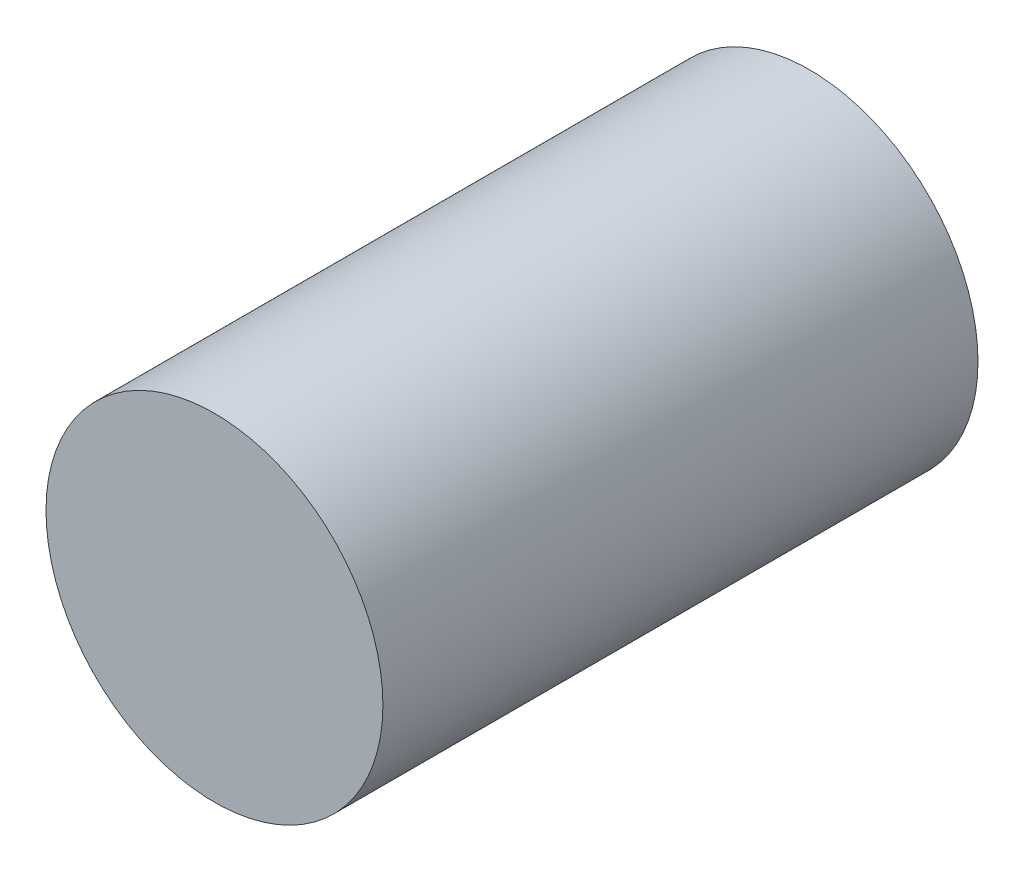
ISO-10303-21;
HEADER;
FILE_DESCRIPTION(('STEP AP214'),'2;1');
FILE_NAME('part.step','',(''),(''),'','','');
FILE_SCHEMA(('AUTOMOTIVE_DESIGN { 1 0 10303 214 1 1 1 1 }'));
ENDSEC;
DATA;
#1=APPLICATION_CONTEXT('core data for automotive mechanical design processes');
#2=APPLICATION_PROTOCOL_DEFINITION('international standard','automotive_design',2000,#1);
#3=PRODUCT_CONTEXT('',#1,'mechanical');
#4=PRODUCT('Part','Part','',(#3));
#5=PRODUCT_RELATED_PRODUCT_CATEGORY('part','',(#4));
#6=PRODUCT_DEFINITION_FORMATION('','',#4);
#7=PRODUCT_DEFINITION_CONTEXT('part definition',#1,'design');
#8=PRODUCT_DEFINITION('design','',#6,#7);
#9=PRODUCT_DEFINITION_SHAPE('','',#8);
#10=(LENGTH_UNIT() NAMED_UNIT(*) SI_UNIT(.MILLI.,.METRE.));
#11=(NAMED_UNIT(*) PLANE_ANGLE_UNIT() SI_UNIT($,.RADIAN.));
#12=(NAMED_UNIT(*) SI_UNIT($,.STERADIAN.) SOLID_ANGLE_UNIT());
#13=UNCERTAINTY_MEASURE_WITH_UNIT(LENGTH_MEASURE(1.E-05),#10,'distance_accuracy_value','');
#14=(GEOMETRIC_REPRESENTATION_CONTEXT(3) GLOBAL_UNCERTAINTY_ASSIGNED_CONTEXT((#13)) GLOBAL_UNIT_ASSIGNED_CONTEXT((#10,
#11,#12)) REPRESENTATION_CONTEXT('',''));
#15=CARTESIAN_POINT('',(0.,0.,0.));
#16=DIRECTION('',(0.,0.,1.));
#17=DIRECTION('',(1.,0.,0.));
#18=AXIS2_PLACEMENT_3D('',#15,#16,#17);
#19=CARTESIAN_POINT('',(0.,0.,47.69));
#20=DIRECTION('',(0.,0.,-1.));
#21=DIRECTION('',(-1.,0.,0.));
#22=AXIS2_PLACEMENT_3D('',#19,#20,#21);
#23=CYLINDRICAL_SURFACE('',#22,13.5);
#24=CARTESIAN_POINT('',(0.,0.,47.69));
#25=DIRECTION('',(0.,0.,1.));
#26=DIRECTION('',(1.,0.,0.));
#27=AXIS2_PLACEMENT_3D('',#24,#25,#26);
#28=CIRCLE('',#27,13.5);
#29=CARTESIAN_POINT('',(-13.5,0.,47.69));
#30=VERTEX_POINT('',#29);
#31=EDGE_CURVE('E10',#30,#30,#28,.T.);
#32=CARTESIAN_POINT('',(0.,0.,0.));
#33=DIRECTION('',(0.,0.,1.));
#34=DIRECTION('',(1.,0.,0.));
#35=AXIS2_PLACEMENT_3D('',#32,#33,#34);
#36=CIRCLE('',#35,13.5);
#37=CARTESIAN_POINT('',(-13.5,0.,0.));
#38=VERTEX_POINT('',#37);
#39=EDGE_CURVE('E35',#38,#38,#36,.T.);
#40=CARTESIAN_POINT('',(-13.5,0.,47.69));
#41=CARTESIAN_POINT('',(-13.5,0.,47.1932291666667));
#42=CARTESIAN_POINT('',(-13.5,0.,46.6964583333333));
#43=CARTESIAN_POINT('',(-13.5,0.,45.7029166666667));
#44=CARTESIAN_POINT('',(-13.5,0.,45.2061458333333));
#45=CARTESIAN_POINT('',(-13.5,0.,44.2126041666667));
#46=CARTESIAN_POINT('',(-13.5,0.,43.7158333333333));
#47=CARTESIAN_POINT('',(-13.5,0.,42.7222916666667));
#48=CARTESIAN_POINT('',(-13.5,0.,42.2255208333333));
#49=CARTESIAN_POINT('',(-13.5,0.,41.2319791666667));
#50=CARTESIAN_POINT('',(-13.5,0.,40.7352083333333));
#51=CARTESIAN_POINT('',(-13.5,0.,39.7416666666667));
#52=CARTESIAN_POINT('',(-13.5,0.,39.2448958333333));
#53=CARTESIAN_POINT('',(-13.5,0.,38.2513541666667));
#54=CARTESIAN_POINT('',(-13.5,0.,37.7545833333333));
#55=CARTESIAN_POINT('',(-13.5,0.,36.7610416666667));
#56=CARTESIAN_POINT('',(-13.5,0.,36.2642708333333));
#57=CARTESIAN_POINT('',(-13.5,0.,35.2707291666667));
#58=CARTESIAN_POINT('',(-13.5,0.,34.7739583333333));
#59=CARTESIAN_POINT('',(-13.5,0.,33.7804166666667));
#60=CARTESIAN_POINT('',(-13.5,0.,33.2836458333333));
#61=CARTESIAN_POINT('',(-13.5,0.,32.2901041666667));
#62=CARTESIAN_POINT('',(-13.5,0.,31.7933333333333));
#63=CARTESIAN_POINT('',(-13.5,0.,30.7997916666667));
#64=CARTESIAN_POINT('',(-13.5,0.,30.3030208333333));
#65=CARTESIAN_POINT('',(-13.5,0.,29.3094791666667));
#66=CARTESIAN_POINT('',(-13.5,0.,28.8127083333333));
#67=CARTESIAN_POINT('',(-13.5,0.,27.8191666666667));
#68=CARTESIAN_POINT('',(-13.5,0.,27.3223958333333));
#69=CARTESIAN_POINT('',(-13.5,0.,26.3288541666667));
#70=CARTESIAN_POINT('',(-13.5,0.,25.8320833333333));
#71=CARTESIAN_POINT('',(-13.5,0.,24.8385416666667));
#72=CARTESIAN_POINT('',(-13.5,0.,24.3417708333333));
#73=CARTESIAN_POINT('',(-13.5,0.,23.3482291666667));
#74=CARTESIAN_POINT('',(-13.5,0.,22.8514583333333));
#75=CARTESIAN_POINT('',(-13.5,0.,21.8579166666667));
#76=CARTESIAN_POINT('',(-13.5,0.,21.3611458333333));
#77=CARTESIAN_POINT('',(-13.5,0.,20.3676041666667));
#78=CARTESIAN_POINT('',(-13.5,0.,19.8708333333333));
#79=CARTESIAN_POINT('',(-13.5,0.,18.8772916666667));
#80=CARTESIAN_POINT('',(-13.5,0.,18.3805208333333));
#81=CARTESIAN_POINT('',(-13.5,0.,17.3869791666667));
#82=CARTESIAN_POINT('',(-13.5,0.,16.8902083333333));
#83=CARTESIAN_POINT('',(-13.5,0.,15.8966666666667));
#84=CARTESIAN_POINT('',(-13.5,0.,15.3998958333333));
#85=CARTESIAN_POINT('',(-13.5,0.,14.4063541666667));
#86=CARTESIAN_POINT('',(-13.5,0.,13.9095833333333));
#87=CARTESIAN_POINT('',(-13.5,0.,12.9160416666667));
#88=CARTESIAN_POINT('',(-13.5,0.,12.4192708333333));
#89=CARTESIAN_POINT('',(-13.5,0.,11.4257291666667));
#90=CARTESIAN_POINT('',(-13.5,0.,10.9289583333333));
#91=CARTESIAN_POINT('',(-13.5,0.,9.93541666666666));
#92=CARTESIAN_POINT('',(-13.5,0.,9.43864583333333));
#93=CARTESIAN_POINT('',(-13.5,0.,8.44510416666666));
#94=CARTESIAN_POINT('',(-13.5,0.,7.94833333333333));
#95=CARTESIAN_POINT('',(-13.5,0.,6.95479166666666));
#96=CARTESIAN_POINT('',(-13.5,0.,6.45802083333333));
#97=CARTESIAN_POINT('',(-13.5,0.,5.46447916666666));
#98=CARTESIAN_POINT('',(-13.5,0.,4.96770833333333));
#99=CARTESIAN_POINT('',(-13.5,0.,3.97416666666666));
#100=CARTESIAN_POINT('',(-13.5,0.,3.47739583333333));
#101=CARTESIAN_POINT('',(-13.5,0.,2.48385416666666));
#102=CARTESIAN_POINT('',(-13.5,0.,1.98708333333333));
#103=CARTESIAN_POINT('',(-13.5,0.,0.99354166666666));
#104=CARTESIAN_POINT('',(-13.5,0.,0.496770833333327));
#105=CARTESIAN_POINT('',(-13.5,0.,0.));
#106=B_SPLINE_CURVE_WITH_KNOTS('',3,(#40,#41,#42,#43,#44,#45,#46,#47,#48,#49,#50,#51,#52,#53,
#54,#55,#56,#57,#58,#59,#60,#61,#62,#63,#64,#65,#66,#67,#68,#69,#70,#71,#72,#73,#74,#75,#76,#77,
#78,#79,#80,#81,#82,#83,#84,#85,#86,#87,#88,#89,#90,#91,#92,#93,#94,#95,#96,#97,#98,#99,#100,
#101,#102,#103,#104,#105),.UNSPECIFIED.,.F.,.F.,(4,2,2,2,2,2,2,2,2,2,2,2,2,2,2,2,2,2,2,2,2,2,2,
2,2,2,2,2,2,2,2,2,4),(0.,1.49031249999999,2.98062499999999,4.47093749999999,5.96124999999999,
7.45156249999999,8.94187499999999,10.4321875,11.9225,13.4128125,14.903125,16.3934375,17.88375,
19.3740625,20.864375,22.3546875,23.845,25.3353125,26.825625,28.3159375,29.80625,31.2965625,
32.786875,34.2771875,35.7675,37.2578125,38.748125,40.2384375,41.72875,43.2190625,44.709375,
46.1996875,47.69),.UNSPECIFIED.);
#107=EDGE_CURVE('BSEAM32',#30,#38,#106,.T.);
#108=ORIENTED_EDGE('',*,*,#31,.F.);
#109=ORIENTED_EDGE('',*,*,#39,.T.);
#110=ORIENTED_EDGE('',*,*,#107,.T.);
#111=ORIENTED_EDGE('',*,*,#107,.F.);
#112=EDGE_LOOP('',(#108,#110,#109,#111));
#113=FACE_BOUND('',#112,.T.);
#114=ADVANCED_FACE('F32',(#113),#23,.T.);
#115=CARTESIAN_POINT('',(0.,0.,47.69));
#116=DIRECTION('',(0.,0.,1.));
#117=DIRECTION('',(1.,0.,0.));
#118=AXIS2_PLACEMENT_3D('',#115,#116,#117);
#119=PLANE('',#118);
#120=ORIENTED_EDGE('',*,*,#31,.T.);
#121=EDGE_LOOP('',(#120));
#122=FACE_BOUND('',#121,.T.);
#123=ADVANCED_FACE('F47',(#122),#119,.T.);
#124=CARTESIAN_POINT('',(0.,0.,0.));
#125=DIRECTION('',(0.,0.,1.));
#126=DIRECTION('',(1.,0.,0.));
#127=AXIS2_PLACEMENT_3D('',#124,#125,#126);
#128=PLANE('',#127);
#129=ORIENTED_EDGE('',*,*,#39,.F.);
#130=EDGE_LOOP('',(#129));
#131=FACE_BOUND('',#130,.T.);
#132=ADVANCED_FACE('F45',(#131),#128,.F.);
#133=CLOSED_SHELL('',(#114,#123,#132));
#134=MANIFOLD_SOLID_BREP('B2',#133);
#135=ADVANCED_BREP_SHAPE_REPRESENTATION('',(#18,#134),#14);
#136=SHAPE_DEFINITION_REPRESENTATION(#9,#135);
ENDSEC;
END-ISO-10303-21;
